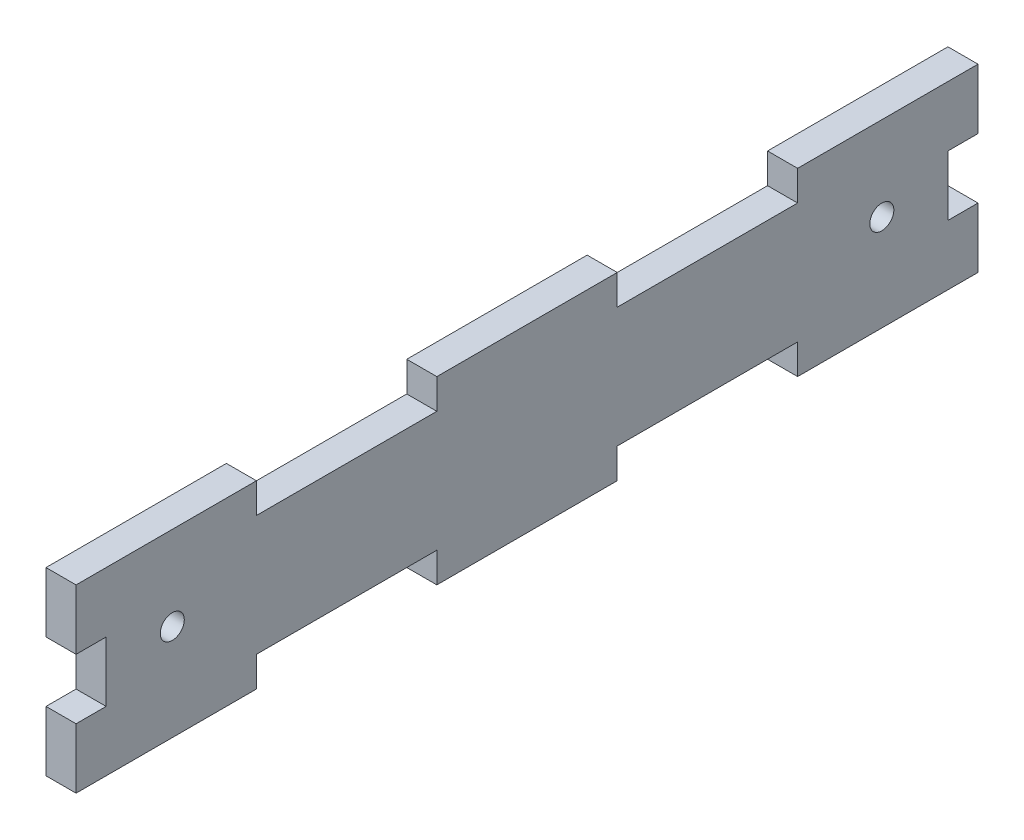
ISO-10303-21;
HEADER;
FILE_DESCRIPTION(('STEP AP214'),'2;1');
FILE_NAME('part.step','',(''),(''),'','','');
FILE_SCHEMA(('AUTOMOTIVE_DESIGN { 1 0 10303 214 1 1 1 1 }'));
ENDSEC;
DATA;
#1=APPLICATION_CONTEXT('core data for automotive mechanical design processes');
#2=APPLICATION_PROTOCOL_DEFINITION('international standard','automotive_design',2000,#1);
#3=PRODUCT_CONTEXT('',#1,'mechanical');
#4=PRODUCT('Part','Part','',(#3));
#5=PRODUCT_RELATED_PRODUCT_CATEGORY('part','',(#4));
#6=PRODUCT_DEFINITION_FORMATION('','',#4);
#7=PRODUCT_DEFINITION_CONTEXT('part definition',#1,'design');
#8=PRODUCT_DEFINITION('design','',#6,#7);
#9=PRODUCT_DEFINITION_SHAPE('','',#8);
#10=(LENGTH_UNIT() NAMED_UNIT(*) SI_UNIT(.MILLI.,.METRE.));
#11=(NAMED_UNIT(*) PLANE_ANGLE_UNIT() SI_UNIT($,.RADIAN.));
#12=(NAMED_UNIT(*) SI_UNIT($,.STERADIAN.) SOLID_ANGLE_UNIT());
#13=UNCERTAINTY_MEASURE_WITH_UNIT(LENGTH_MEASURE(1.E-05),#10,'distance_accuracy_value','');
#14=(GEOMETRIC_REPRESENTATION_CONTEXT(3) GLOBAL_UNCERTAINTY_ASSIGNED_CONTEXT((#13)) GLOBAL_UNIT_ASSIGNED_CONTEXT((#10,
#11,#12)) REPRESENTATION_CONTEXT('',''));
#15=CARTESIAN_POINT('',(0.,0.,0.));
#16=DIRECTION('',(0.,0.,1.));
#17=DIRECTION('',(1.,0.,0.));
#18=AXIS2_PLACEMENT_3D('',#15,#16,#17);
#19=CARTESIAN_POINT('',(5.,0.,0.));
#20=DIRECTION('',(1.,0.,0.));
#21=DIRECTION('',(0.,0.,-1.));
#22=AXIS2_PLACEMENT_3D('',#19,#20,#21);
#23=PLANE('',#22);
#24=CARTESIAN_POINT('',(5.,16.,-16.));
#25=DIRECTION('',(1.,0.,0.));
#26=DIRECTION('',(0.,0.,-1.));
#27=AXIS2_PLACEMENT_3D('',#24,#25,#26);
#28=CIRCLE('',#27,2.);
#29=CARTESIAN_POINT('',(5.,16.,-18.));
#30=VERTEX_POINT('',#29);
#31=EDGE_CURVE('E258',#30,#30,#28,.T.);
#32=ORIENTED_EDGE('',*,*,#31,.F.);
#33=EDGE_LOOP('',(#32));
#34=FACE_BOUND('',#33,.T.);
#35=DIRECTION('',(0.,-1.,0.));
#36=VECTOR('',#35,1.);
#37=CARTESIAN_POINT('',(5.,0.,0.));
#38=LINE('',#37,#36);
#39=CARTESIAN_POINT('',(5.,10.,0.));
#40=VERTEX_POINT('',#39);
#41=CARTESIAN_POINT('',(5.,0.,0.));
#42=VERTEX_POINT('',#41);
#43=EDGE_CURVE('E309',#40,#42,#38,.T.);
#44=ORIENTED_EDGE('',*,*,#43,.T.);
#45=DIRECTION('',(0.,0.,-1.));
#46=VECTOR('',#45,1.);
#47=CARTESIAN_POINT('',(5.,0.,0.));
#48=LINE('',#47,#46);
#49=CARTESIAN_POINT('',(5.,0.,-30.));
#50=VERTEX_POINT('',#49);
#51=EDGE_CURVE('E157',#42,#50,#48,.T.);
#52=ORIENTED_EDGE('',*,*,#51,.T.);
#53=DIRECTION('',(0.,1.,0.));
#54=VECTOR('',#53,1.);
#55=CARTESIAN_POINT('',(5.,0.,-30.));
#56=LINE('',#55,#54);
#57=CARTESIAN_POINT('',(5.,5.,-30.));
#58=VERTEX_POINT('',#57);
#59=EDGE_CURVE('E384',#50,#58,#56,.T.);
#60=ORIENTED_EDGE('',*,*,#59,.T.);
#61=DIRECTION('',(0.,0.,-1.));
#62=VECTOR('',#61,1.);
#63=CARTESIAN_POINT('',(5.,5.,-30.));
#64=LINE('',#63,#62);
#65=CARTESIAN_POINT('',(5.,5.,-60.));
#66=VERTEX_POINT('',#65);
#67=EDGE_CURVE('E403',#58,#66,#64,.T.);
#68=ORIENTED_EDGE('',*,*,#67,.T.);
#69=DIRECTION('',(0.,-1.,0.));
#70=VECTOR('',#69,1.);
#71=CARTESIAN_POINT('',(5.,5.,-60.));
#72=LINE('',#71,#70);
#73=CARTESIAN_POINT('',(5.,0.,-60.));
#74=VERTEX_POINT('',#73);
#75=EDGE_CURVE('E400',#66,#74,#72,.T.);
#76=ORIENTED_EDGE('',*,*,#75,.T.);
#77=DIRECTION('',(0.,0.,-1.));
#78=VECTOR('',#77,1.);
#79=CARTESIAN_POINT('',(5.,0.,-60.));
#80=LINE('',#79,#78);
#81=CARTESIAN_POINT('',(5.,0.,-90.));
#82=VERTEX_POINT('',#81);
#83=EDGE_CURVE('E402',#74,#82,#80,.T.);
#84=ORIENTED_EDGE('',*,*,#83,.T.);
#85=DIRECTION('',(0.,1.,0.));
#86=VECTOR('',#85,1.);
#87=CARTESIAN_POINT('',(5.,5.,-90.));
#88=LINE('',#87,#86);
#89=CARTESIAN_POINT('',(5.,5.,-90.));
#90=VERTEX_POINT('',#89);
#91=EDGE_CURVE('E405',#82,#90,#88,.T.);
#92=ORIENTED_EDGE('',*,*,#91,.T.);
#93=DIRECTION('',(0.,0.,-1.));
#94=VECTOR('',#93,1.);
#95=CARTESIAN_POINT('',(5.,5.00000000000001,-120.));
#96=LINE('',#95,#94);
#97=CARTESIAN_POINT('',(5.,5.00000000000001,-120.));
#98=VERTEX_POINT('',#97);
#99=EDGE_CURVE('E411',#90,#98,#96,.T.);
#100=ORIENTED_EDGE('',*,*,#99,.T.);
#101=DIRECTION('',(0.,-1.,0.));
#102=VECTOR('',#101,1.);
#103=CARTESIAN_POINT('',(5.,0.,-120.));
#104=LINE('',#103,#102);
#105=CARTESIAN_POINT('',(5.,0.,-120.));
#106=VERTEX_POINT('',#105);
#107=EDGE_CURVE('E413',#98,#106,#104,.T.);
#108=ORIENTED_EDGE('',*,*,#107,.T.);
#109=DIRECTION('',(0.,0.,-1.));
#110=VECTOR('',#109,1.);
#111=CARTESIAN_POINT('',(5.,0.,-120.));
#112=LINE('',#111,#110);
#113=CARTESIAN_POINT('',(5.,0.,-150.));
#114=VERTEX_POINT('',#113);
#115=EDGE_CURVE('E415',#106,#114,#112,.T.);
#116=ORIENTED_EDGE('',*,*,#115,.T.);
#117=DIRECTION('',(0.,1.,0.));
#118=VECTOR('',#117,1.);
#119=CARTESIAN_POINT('',(5.,0.,-150.));
#120=LINE('',#119,#118);
#121=CARTESIAN_POINT('',(5.,10.,-150.));
#122=VERTEX_POINT('',#121);
#123=EDGE_CURVE('E417',#114,#122,#120,.T.);
#124=ORIENTED_EDGE('',*,*,#123,.T.);
#125=DIRECTION('',(0.,0.,1.));
#126=VECTOR('',#125,1.);
#127=CARTESIAN_POINT('',(5.,10.,-145.));
#128=LINE('',#127,#126);
#129=CARTESIAN_POINT('',(5.,10.,-145.));
#130=VERTEX_POINT('',#129);
#131=EDGE_CURVE('E419',#122,#130,#128,.T.);
#132=ORIENTED_EDGE('',*,*,#131,.T.);
#133=DIRECTION('',(0.,1.,0.));
#134=VECTOR('',#133,1.);
#135=CARTESIAN_POINT('',(5.,20.,-145.));
#136=LINE('',#135,#134);
#137=CARTESIAN_POINT('',(5.,20.,-145.));
#138=VERTEX_POINT('',#137);
#139=EDGE_CURVE('E421',#130,#138,#136,.T.);
#140=ORIENTED_EDGE('',*,*,#139,.T.);
#141=DIRECTION('',(0.,0.,-1.));
#142=VECTOR('',#141,1.);
#143=CARTESIAN_POINT('',(5.,20.,-150.));
#144=LINE('',#143,#142);
#145=CARTESIAN_POINT('',(5.,20.,-150.));
#146=VERTEX_POINT('',#145);
#147=EDGE_CURVE('E423',#138,#146,#144,.T.);
#148=ORIENTED_EDGE('',*,*,#147,.T.);
#149=DIRECTION('',(0.,1.,0.));
#150=VECTOR('',#149,1.);
#151=CARTESIAN_POINT('',(5.,20.,-150.));
#152=LINE('',#151,#150);
#153=CARTESIAN_POINT('',(5.,30.,-150.));
#154=VERTEX_POINT('',#153);
#155=EDGE_CURVE('E425',#146,#154,#152,.T.);
#156=ORIENTED_EDGE('',*,*,#155,.T.);
#157=DIRECTION('',(0.,0.,1.));
#158=VECTOR('',#157,1.);
#159=CARTESIAN_POINT('',(5.,30.,-120.));
#160=LINE('',#159,#158);
#161=CARTESIAN_POINT('',(5.,30.,-120.));
#162=VERTEX_POINT('',#161);
#163=EDGE_CURVE('E427',#154,#162,#160,.T.);
#164=ORIENTED_EDGE('',*,*,#163,.T.);
#165=DIRECTION('',(0.,-1.,0.));
#166=VECTOR('',#165,1.);
#167=CARTESIAN_POINT('',(5.,30.,-120.));
#168=LINE('',#167,#166);
#169=CARTESIAN_POINT('',(5.,25.,-120.));
#170=VERTEX_POINT('',#169);
#171=EDGE_CURVE('E429',#162,#170,#168,.T.);
#172=ORIENTED_EDGE('',*,*,#171,.T.);
#173=DIRECTION('',(0.,0.,1.));
#174=VECTOR('',#173,1.);
#175=CARTESIAN_POINT('',(5.,25.,-120.));
#176=LINE('',#175,#174);
#177=CARTESIAN_POINT('',(5.,25.,-90.));
#178=VERTEX_POINT('',#177);
#179=EDGE_CURVE('E431',#170,#178,#176,.T.);
#180=ORIENTED_EDGE('',*,*,#179,.T.);
#181=DIRECTION('',(0.,1.,0.));
#182=VECTOR('',#181,1.);
#183=CARTESIAN_POINT('',(5.,25.,-90.));
#184=LINE('',#183,#182);
#185=CARTESIAN_POINT('',(5.,30.,-90.));
#186=VERTEX_POINT('',#185);
#187=EDGE_CURVE('E433',#178,#186,#184,.T.);
#188=ORIENTED_EDGE('',*,*,#187,.T.);
#189=DIRECTION('',(0.,0.,1.));
#190=VECTOR('',#189,1.);
#191=CARTESIAN_POINT('',(5.,30.,-60.));
#192=LINE('',#191,#190);
#193=CARTESIAN_POINT('',(5.,30.,-60.));
#194=VERTEX_POINT('',#193);
#195=EDGE_CURVE('E435',#186,#194,#192,.T.);
#196=ORIENTED_EDGE('',*,*,#195,.T.);
#197=DIRECTION('',(0.,-1.,0.));
#198=VECTOR('',#197,1.);
#199=CARTESIAN_POINT('',(5.,25.,-60.));
#200=LINE('',#199,#198);
#201=CARTESIAN_POINT('',(5.,25.,-60.));
#202=VERTEX_POINT('',#201);
#203=EDGE_CURVE('E437',#194,#202,#200,.T.);
#204=ORIENTED_EDGE('',*,*,#203,.T.);
#205=DIRECTION('',(0.,0.,1.));
#206=VECTOR('',#205,1.);
#207=CARTESIAN_POINT('',(5.,25.,-30.));
#208=LINE('',#207,#206);
#209=CARTESIAN_POINT('',(5.,25.,-30.));
#210=VERTEX_POINT('',#209);
#211=EDGE_CURVE('E439',#202,#210,#208,.T.);
#212=ORIENTED_EDGE('',*,*,#211,.T.);
#213=DIRECTION('',(0.,1.,0.));
#214=VECTOR('',#213,1.);
#215=CARTESIAN_POINT('',(5.,30.,-30.));
#216=LINE('',#215,#214);
#217=CARTESIAN_POINT('',(5.,30.,-30.));
#218=VERTEX_POINT('',#217);
#219=EDGE_CURVE('E441',#210,#218,#216,.T.);
#220=ORIENTED_EDGE('',*,*,#219,.T.);
#221=DIRECTION('',(0.,0.,1.));
#222=VECTOR('',#221,1.);
#223=CARTESIAN_POINT('',(5.,30.,0.));
#224=LINE('',#223,#222);
#225=CARTESIAN_POINT('',(5.,30.,0.));
#226=VERTEX_POINT('',#225);
#227=EDGE_CURVE('E443',#218,#226,#224,.T.);
#228=ORIENTED_EDGE('',*,*,#227,.T.);
#229=DIRECTION('',(0.,-1.,0.));
#230=VECTOR('',#229,1.);
#231=CARTESIAN_POINT('',(5.,20.,0.));
#232=LINE('',#231,#230);
#233=CARTESIAN_POINT('',(5.,20.,0.));
#234=VERTEX_POINT('',#233);
#235=EDGE_CURVE('E236',#226,#234,#232,.T.);
#236=ORIENTED_EDGE('',*,*,#235,.T.);
#237=DIRECTION('',(0.,0.,-1.));
#238=VECTOR('',#237,1.);
#239=CARTESIAN_POINT('',(5.,20.,0.));
#240=LINE('',#239,#238);
#241=CARTESIAN_POINT('',(5.,20.,-5.));
#242=VERTEX_POINT('',#241);
#243=EDGE_CURVE('E230',#234,#242,#240,.T.);
#244=ORIENTED_EDGE('',*,*,#243,.T.);
#245=DIRECTION('',(0.,-1.,0.));
#246=VECTOR('',#245,1.);
#247=CARTESIAN_POINT('',(5.,20.,-5.));
#248=LINE('',#247,#246);
#249=CARTESIAN_POINT('',(5.,10.,-5.));
#250=VERTEX_POINT('',#249);
#251=EDGE_CURVE('E234',#242,#250,#248,.T.);
#252=ORIENTED_EDGE('',*,*,#251,.T.);
#253=DIRECTION('',(0.,0.,1.));
#254=VECTOR('',#253,1.);
#255=CARTESIAN_POINT('',(5.,10.,-5.));
#256=LINE('',#255,#254);
#257=EDGE_CURVE('E54',#250,#40,#256,.T.);
#258=ORIENTED_EDGE('',*,*,#257,.T.);
#259=EDGE_LOOP('',(#44,#52,#60,#68,#76,#84,#92,#100,#108,#116,#124,#132,#140,#148,#156,#164,
#172,#180,#188,#196,#204,#212,#220,#228,#236,#244,#252,#258));
#260=FACE_BOUND('',#259,.T.);
#261=CARTESIAN_POINT('',(5.,16.,-134.));
#262=DIRECTION('',(1.,0.,0.));
#263=DIRECTION('',(0.,0.,1.));
#264=AXIS2_PLACEMENT_3D('',#261,#262,#263);
#265=CIRCLE('',#264,2.);
#266=CARTESIAN_POINT('',(5.,16.,-132.));
#267=VERTEX_POINT('',#266);
#268=EDGE_CURVE('E485',#267,#267,#265,.T.);
#269=ORIENTED_EDGE('',*,*,#268,.F.);
#270=EDGE_LOOP('',(#269));
#271=FACE_BOUND('',#270,.T.);
#272=ADVANCED_FACE('F37',(#34,#260,#271),#23,.T.);
#273=CARTESIAN_POINT('',(0.,0.,0.));
#274=DIRECTION('',(1.,0.,0.));
#275=DIRECTION('',(0.,0.,-1.));
#276=AXIS2_PLACEMENT_3D('',#273,#274,#275);
#277=PLANE('',#276);
#278=DIRECTION('',(0.,-1.,0.));
#279=VECTOR('',#278,1.);
#280=CARTESIAN_POINT('',(0.,0.,0.));
#281=LINE('',#280,#279);
#282=CARTESIAN_POINT('',(0.,10.,0.));
#283=VERTEX_POINT('',#282);
#284=CARTESIAN_POINT('',(0.,0.,0.));
#285=VERTEX_POINT('',#284);
#286=EDGE_CURVE('E254',#283,#285,#281,.T.);
#287=ORIENTED_EDGE('',*,*,#286,.F.);
#288=DIRECTION('',(0.,0.,1.));
#289=VECTOR('',#288,1.);
#290=CARTESIAN_POINT('',(0.,10.,-5.));
#291=LINE('',#290,#289);
#292=CARTESIAN_POINT('',(0.,10.,-5.));
#293=VERTEX_POINT('',#292);
#294=EDGE_CURVE('E149',#293,#283,#291,.T.);
#295=ORIENTED_EDGE('',*,*,#294,.F.);
#296=DIRECTION('',(0.,-1.,0.));
#297=VECTOR('',#296,1.);
#298=CARTESIAN_POINT('',(0.,20.,-5.));
#299=LINE('',#298,#297);
#300=CARTESIAN_POINT('',(0.,20.,-5.));
#301=VERTEX_POINT('',#300);
#302=EDGE_CURVE('E143',#301,#293,#299,.T.);
#303=ORIENTED_EDGE('',*,*,#302,.F.);
#304=DIRECTION('',(0.,0.,-1.));
#305=VECTOR('',#304,1.);
#306=CARTESIAN_POINT('',(0.,20.,0.));
#307=LINE('',#306,#305);
#308=CARTESIAN_POINT('',(0.,20.,0.));
#309=VERTEX_POINT('',#308);
#310=EDGE_CURVE('E244',#309,#301,#307,.T.);
#311=ORIENTED_EDGE('',*,*,#310,.F.);
#312=DIRECTION('',(0.,-1.,0.));
#313=VECTOR('',#312,1.);
#314=CARTESIAN_POINT('',(0.,20.,0.));
#315=LINE('',#314,#313);
#316=CARTESIAN_POINT('',(0.,30.,0.));
#317=VERTEX_POINT('',#316);
#318=EDGE_CURVE('E304',#317,#309,#315,.T.);
#319=ORIENTED_EDGE('',*,*,#318,.F.);
#320=DIRECTION('',(0.,0.,1.));
#321=VECTOR('',#320,1.);
#322=CARTESIAN_POINT('',(0.,30.,0.));
#323=LINE('',#322,#321);
#324=CARTESIAN_POINT('',(0.,30.,-30.));
#325=VERTEX_POINT('',#324);
#326=EDGE_CURVE('E302',#325,#317,#323,.T.);
#327=ORIENTED_EDGE('',*,*,#326,.F.);
#328=DIRECTION('',(0.,1.,0.));
#329=VECTOR('',#328,1.);
#330=CARTESIAN_POINT('',(0.,30.,-30.));
#331=LINE('',#330,#329);
#332=CARTESIAN_POINT('',(0.,25.,-30.));
#333=VERTEX_POINT('',#332);
#334=EDGE_CURVE('E300',#333,#325,#331,.T.);
#335=ORIENTED_EDGE('',*,*,#334,.F.);
#336=DIRECTION('',(0.,0.,1.));
#337=VECTOR('',#336,1.);
#338=CARTESIAN_POINT('',(0.,25.,-30.));
#339=LINE('',#338,#337);
#340=CARTESIAN_POINT('',(0.,25.,-60.));
#341=VERTEX_POINT('',#340);
#342=EDGE_CURVE('E298',#341,#333,#339,.T.);
#343=ORIENTED_EDGE('',*,*,#342,.F.);
#344=DIRECTION('',(0.,-1.,0.));
#345=VECTOR('',#344,1.);
#346=CARTESIAN_POINT('',(0.,25.,-60.));
#347=LINE('',#346,#345);
#348=CARTESIAN_POINT('',(0.,30.,-60.));
#349=VERTEX_POINT('',#348);
#350=EDGE_CURVE('E296',#349,#341,#347,.T.);
#351=ORIENTED_EDGE('',*,*,#350,.F.);
#352=DIRECTION('',(0.,0.,1.));
#353=VECTOR('',#352,1.);
#354=CARTESIAN_POINT('',(0.,30.,-60.));
#355=LINE('',#354,#353);
#356=CARTESIAN_POINT('',(0.,30.,-90.));
#357=VERTEX_POINT('',#356);
#358=EDGE_CURVE('E294',#357,#349,#355,.T.);
#359=ORIENTED_EDGE('',*,*,#358,.F.);
#360=DIRECTION('',(0.,1.,0.));
#361=VECTOR('',#360,1.);
#362=CARTESIAN_POINT('',(0.,25.,-90.));
#363=LINE('',#362,#361);
#364=CARTESIAN_POINT('',(0.,25.,-90.));
#365=VERTEX_POINT('',#364);
#366=EDGE_CURVE('E292',#365,#357,#363,.T.);
#367=ORIENTED_EDGE('',*,*,#366,.F.);
#368=DIRECTION('',(0.,0.,1.));
#369=VECTOR('',#368,1.);
#370=CARTESIAN_POINT('',(0.,25.,-120.));
#371=LINE('',#370,#369);
#372=CARTESIAN_POINT('',(0.,25.,-120.));
#373=VERTEX_POINT('',#372);
#374=EDGE_CURVE('E290',#373,#365,#371,.T.);
#375=ORIENTED_EDGE('',*,*,#374,.F.);
#376=DIRECTION('',(0.,-1.,0.));
#377=VECTOR('',#376,1.);
#378=CARTESIAN_POINT('',(0.,30.,-120.));
#379=LINE('',#378,#377);
#380=CARTESIAN_POINT('',(0.,30.,-120.));
#381=VERTEX_POINT('',#380);
#382=EDGE_CURVE('E288',#381,#373,#379,.T.);
#383=ORIENTED_EDGE('',*,*,#382,.F.);
#384=DIRECTION('',(0.,0.,1.));
#385=VECTOR('',#384,1.);
#386=CARTESIAN_POINT('',(0.,30.,-120.));
#387=LINE('',#386,#385);
#388=CARTESIAN_POINT('',(0.,30.,-150.));
#389=VERTEX_POINT('',#388);
#390=EDGE_CURVE('E286',#389,#381,#387,.T.);
#391=ORIENTED_EDGE('',*,*,#390,.F.);
#392=DIRECTION('',(0.,1.,0.));
#393=VECTOR('',#392,1.);
#394=CARTESIAN_POINT('',(0.,20.,-150.));
#395=LINE('',#394,#393);
#396=CARTESIAN_POINT('',(0.,20.,-150.));
#397=VERTEX_POINT('',#396);
#398=EDGE_CURVE('E284',#397,#389,#395,.T.);
#399=ORIENTED_EDGE('',*,*,#398,.F.);
#400=DIRECTION('',(0.,0.,-1.));
#401=VECTOR('',#400,1.);
#402=CARTESIAN_POINT('',(0.,20.,-150.));
#403=LINE('',#402,#401);
#404=CARTESIAN_POINT('',(0.,20.,-145.));
#405=VERTEX_POINT('',#404);
#406=EDGE_CURVE('E282',#405,#397,#403,.T.);
#407=ORIENTED_EDGE('',*,*,#406,.F.);
#408=DIRECTION('',(0.,1.,0.));
#409=VECTOR('',#408,1.);
#410=CARTESIAN_POINT('',(0.,20.,-145.));
#411=LINE('',#410,#409);
#412=CARTESIAN_POINT('',(0.,10.,-145.));
#413=VERTEX_POINT('',#412);
#414=EDGE_CURVE('E280',#413,#405,#411,.T.);
#415=ORIENTED_EDGE('',*,*,#414,.F.);
#416=DIRECTION('',(0.,0.,1.));
#417=VECTOR('',#416,1.);
#418=CARTESIAN_POINT('',(0.,10.,-145.));
#419=LINE('',#418,#417);
#420=CARTESIAN_POINT('',(0.,10.,-150.));
#421=VERTEX_POINT('',#420);
#422=EDGE_CURVE('E278',#421,#413,#419,.T.);
#423=ORIENTED_EDGE('',*,*,#422,.F.);
#424=DIRECTION('',(0.,1.,0.));
#425=VECTOR('',#424,1.);
#426=CARTESIAN_POINT('',(0.,0.,-150.));
#427=LINE('',#426,#425);
#428=CARTESIAN_POINT('',(0.,0.,-150.));
#429=VERTEX_POINT('',#428);
#430=EDGE_CURVE('E276',#429,#421,#427,.T.);
#431=ORIENTED_EDGE('',*,*,#430,.F.);
#432=DIRECTION('',(0.,0.,-1.));
#433=VECTOR('',#432,1.);
#434=CARTESIAN_POINT('',(0.,0.,-120.));
#435=LINE('',#434,#433);
#436=CARTESIAN_POINT('',(0.,0.,-120.));
#437=VERTEX_POINT('',#436);
#438=EDGE_CURVE('E274',#437,#429,#435,.T.);
#439=ORIENTED_EDGE('',*,*,#438,.F.);
#440=DIRECTION('',(0.,-1.,0.));
#441=VECTOR('',#440,1.);
#442=CARTESIAN_POINT('',(0.,0.,-120.));
#443=LINE('',#442,#441);
#444=CARTESIAN_POINT('',(0.,5.00000000000001,-120.));
#445=VERTEX_POINT('',#444);
#446=EDGE_CURVE('E272',#445,#437,#443,.T.);
#447=ORIENTED_EDGE('',*,*,#446,.F.);
#448=DIRECTION('',(0.,0.,-1.));
#449=VECTOR('',#448,1.);
#450=CARTESIAN_POINT('',(0.,5.00000000000001,-120.));
#451=LINE('',#450,#449);
#452=CARTESIAN_POINT('',(0.,5.,-90.));
#453=VERTEX_POINT('',#452);
#454=EDGE_CURVE('E270',#453,#445,#451,.T.);
#455=ORIENTED_EDGE('',*,*,#454,.F.);
#456=DIRECTION('',(0.,1.,0.));
#457=VECTOR('',#456,1.);
#458=CARTESIAN_POINT('',(0.,5.,-90.));
#459=LINE('',#458,#457);
#460=CARTESIAN_POINT('',(0.,0.,-90.));
#461=VERTEX_POINT('',#460);
#462=EDGE_CURVE('E268',#461,#453,#459,.T.);
#463=ORIENTED_EDGE('',*,*,#462,.F.);
#464=DIRECTION('',(0.,0.,-1.));
#465=VECTOR('',#464,1.);
#466=CARTESIAN_POINT('',(0.,0.,-60.));
#467=LINE('',#466,#465);
#468=CARTESIAN_POINT('',(0.,0.,-60.));
#469=VERTEX_POINT('',#468);
#470=EDGE_CURVE('E266',#469,#461,#467,.T.);
#471=ORIENTED_EDGE('',*,*,#470,.F.);
#472=DIRECTION('',(0.,-1.,0.));
#473=VECTOR('',#472,1.);
#474=CARTESIAN_POINT('',(0.,5.,-60.));
#475=LINE('',#474,#473);
#476=CARTESIAN_POINT('',(0.,5.,-60.));
#477=VERTEX_POINT('',#476);
#478=EDGE_CURVE('E264',#477,#469,#475,.T.);
#479=ORIENTED_EDGE('',*,*,#478,.F.);
#480=DIRECTION('',(0.,0.,-1.));
#481=VECTOR('',#480,1.);
#482=CARTESIAN_POINT('',(0.,5.,-30.));
#483=LINE('',#482,#481);
#484=CARTESIAN_POINT('',(0.,5.,-30.));
#485=VERTEX_POINT('',#484);
#486=EDGE_CURVE('E262',#485,#477,#483,.T.);
#487=ORIENTED_EDGE('',*,*,#486,.F.);
#488=DIRECTION('',(0.,1.,0.));
#489=VECTOR('',#488,1.);
#490=CARTESIAN_POINT('',(0.,0.,-30.));
#491=LINE('',#490,#489);
#492=CARTESIAN_POINT('',(0.,0.,-30.));
#493=VERTEX_POINT('',#492);
#494=EDGE_CURVE('E260',#493,#485,#491,.T.);
#495=ORIENTED_EDGE('',*,*,#494,.F.);
#496=DIRECTION('',(0.,0.,-1.));
#497=VECTOR('',#496,1.);
#498=CARTESIAN_POINT('',(0.,0.,0.));
#499=LINE('',#498,#497);
#500=EDGE_CURVE('E257',#285,#493,#499,.T.);
#501=ORIENTED_EDGE('',*,*,#500,.F.);
#502=EDGE_LOOP('',(#287,#295,#303,#311,#319,#327,#335,#343,#351,#359,#367,#375,#383,#391,#399,
#407,#415,#423,#431,#439,#447,#455,#463,#471,#479,#487,#495,#501));
#503=FACE_BOUND('',#502,.T.);
#504=CARTESIAN_POINT('',(0.,16.,-16.));
#505=DIRECTION('',(1.,0.,0.));
#506=DIRECTION('',(0.,0.,-1.));
#507=AXIS2_PLACEMENT_3D('',#504,#505,#506);
#508=CIRCLE('',#507,2.);
#509=CARTESIAN_POINT('',(0.,16.,-18.));
#510=VERTEX_POINT('',#509);
#511=EDGE_CURVE('E491',#510,#510,#508,.T.);
#512=ORIENTED_EDGE('',*,*,#511,.T.);
#513=EDGE_LOOP('',(#512));
#514=FACE_BOUND('',#513,.T.);
#515=CARTESIAN_POINT('',(0.,16.,-134.));
#516=DIRECTION('',(1.,0.,0.));
#517=DIRECTION('',(0.,0.,1.));
#518=AXIS2_PLACEMENT_3D('',#515,#516,#517);
#519=CIRCLE('',#518,2.);
#520=CARTESIAN_POINT('',(0.,16.,-132.));
#521=VERTEX_POINT('',#520);
#522=EDGE_CURVE('E488',#521,#521,#519,.T.);
#523=ORIENTED_EDGE('',*,*,#522,.T.);
#524=EDGE_LOOP('',(#523));
#525=FACE_BOUND('',#524,.T.);
#526=ADVANCED_FACE('F388',(#503,#514,#525),#277,.F.);
#527=CARTESIAN_POINT('',(5.,0.,0.));
#528=DIRECTION('',(0.,0.,-1.));
#529=DIRECTION('',(-1.,0.,0.));
#530=AXIS2_PLACEMENT_3D('',#527,#528,#529);
#531=PLANE('',#530);
#532=ORIENTED_EDGE('',*,*,#286,.T.);
#533=DIRECTION('',(-1.,0.,0.));
#534=VECTOR('',#533,1.);
#535=CARTESIAN_POINT('',(5.,0.,0.));
#536=LINE('',#535,#534);
#537=EDGE_CURVE('E11',#42,#285,#536,.T.);
#538=ORIENTED_EDGE('',*,*,#537,.F.);
#539=ORIENTED_EDGE('',*,*,#43,.F.);
#540=DIRECTION('',(-1.,0.,0.));
#541=VECTOR('',#540,1.);
#542=CARTESIAN_POINT('',(5.,10.,0.));
#543=LINE('',#542,#541);
#544=EDGE_CURVE('E250',#40,#283,#543,.T.);
#545=ORIENTED_EDGE('',*,*,#544,.T.);
#546=EDGE_LOOP('',(#532,#538,#539,#545));
#547=FACE_BOUND('',#546,.T.);
#548=ADVANCED_FACE('F39',(#547),#531,.F.);
#549=CARTESIAN_POINT('',(5.,0.,0.));
#550=DIRECTION('',(0.,1.,0.));
#551=DIRECTION('',(0.,0.,1.));
#552=AXIS2_PLACEMENT_3D('',#549,#550,#551);
#553=PLANE('',#552);
#554=ORIENTED_EDGE('',*,*,#500,.T.);
#555=DIRECTION('',(-1.,0.,0.));
#556=VECTOR('',#555,1.);
#557=CARTESIAN_POINT('',(5.,0.,-30.));
#558=LINE('',#557,#556);
#559=EDGE_CURVE('E46',#50,#493,#558,.T.);
#560=ORIENTED_EDGE('',*,*,#559,.F.);
#561=ORIENTED_EDGE('',*,*,#51,.F.);
#562=ORIENTED_EDGE('',*,*,#537,.T.);
#563=EDGE_LOOP('',(#554,#560,#561,#562));
#564=FACE_BOUND('',#563,.T.);
#565=ADVANCED_FACE('F744',(#564),#553,.F.);
#566=CARTESIAN_POINT('',(5.,0.,-30.));
#567=DIRECTION('',(0.,0.,1.));
#568=DIRECTION('',(1.,0.,0.));
#569=AXIS2_PLACEMENT_3D('',#566,#567,#568);
#570=PLANE('',#569);
#571=ORIENTED_EDGE('',*,*,#494,.T.);
#572=DIRECTION('',(-1.,0.,0.));
#573=VECTOR('',#572,1.);
#574=CARTESIAN_POINT('',(5.,5.,-30.));
#575=LINE('',#574,#573);
#576=EDGE_CURVE('E376',#58,#485,#575,.T.);
#577=ORIENTED_EDGE('',*,*,#576,.F.);
#578=ORIENTED_EDGE('',*,*,#59,.F.);
#579=ORIENTED_EDGE('',*,*,#559,.T.);
#580=EDGE_LOOP('',(#571,#577,#578,#579));
#581=FACE_BOUND('',#580,.T.);
#582=ADVANCED_FACE('F382',(#581),#570,.F.);
#583=CARTESIAN_POINT('',(5.,5.,-30.));
#584=DIRECTION('',(0.,1.,0.));
#585=DIRECTION('',(0.,0.,1.));
#586=AXIS2_PLACEMENT_3D('',#583,#584,#585);
#587=PLANE('',#586);
#588=ORIENTED_EDGE('',*,*,#486,.T.);
#589=DIRECTION('',(-1.,0.,0.));
#590=VECTOR('',#589,1.);
#591=CARTESIAN_POINT('',(5.,5.,-60.));
#592=LINE('',#591,#590);
#593=EDGE_CURVE('E373',#66,#477,#592,.T.);
#594=ORIENTED_EDGE('',*,*,#593,.F.);
#595=ORIENTED_EDGE('',*,*,#67,.F.);
#596=ORIENTED_EDGE('',*,*,#576,.T.);
#597=EDGE_LOOP('',(#588,#594,#595,#596));
#598=FACE_BOUND('',#597,.T.);
#599=ADVANCED_FACE('F394',(#598),#587,.F.);
#600=CARTESIAN_POINT('',(5.,5.,-60.));
#601=DIRECTION('',(0.,0.,-1.));
#602=DIRECTION('',(-1.,0.,0.));
#603=AXIS2_PLACEMENT_3D('',#600,#601,#602);
#604=PLANE('',#603);
#605=ORIENTED_EDGE('',*,*,#478,.T.);
#606=DIRECTION('',(-1.,0.,0.));
#607=VECTOR('',#606,1.);
#608=CARTESIAN_POINT('',(5.,0.,-60.));
#609=LINE('',#608,#607);
#610=EDGE_CURVE('E370',#74,#469,#609,.T.);
#611=ORIENTED_EDGE('',*,*,#610,.F.);
#612=ORIENTED_EDGE('',*,*,#75,.F.);
#613=ORIENTED_EDGE('',*,*,#593,.T.);
#614=EDGE_LOOP('',(#605,#611,#612,#613));
#615=FACE_BOUND('',#614,.T.);
#616=ADVANCED_FACE('F398',(#615),#604,.F.);
#617=CARTESIAN_POINT('',(5.,0.,-60.));
#618=DIRECTION('',(0.,1.,0.));
#619=DIRECTION('',(0.,0.,1.));
#620=AXIS2_PLACEMENT_3D('',#617,#618,#619);
#621=PLANE('',#620);
#622=ORIENTED_EDGE('',*,*,#470,.T.);
#623=DIRECTION('',(-1.,0.,0.));
#624=VECTOR('',#623,1.);
#625=CARTESIAN_POINT('',(5.,0.,-90.));
#626=LINE('',#625,#624);
#627=EDGE_CURVE('E367',#82,#461,#626,.T.);
#628=ORIENTED_EDGE('',*,*,#627,.F.);
#629=ORIENTED_EDGE('',*,*,#83,.F.);
#630=ORIENTED_EDGE('',*,*,#610,.T.);
#631=EDGE_LOOP('',(#622,#628,#629,#630));
#632=FACE_BOUND('',#631,.T.);
#633=ADVANCED_FACE('F709',(#632),#621,.F.);
#634=CARTESIAN_POINT('',(5.,5.,-90.));
#635=DIRECTION('',(0.,0.,1.));
#636=DIRECTION('',(1.,0.,0.));
#637=AXIS2_PLACEMENT_3D('',#634,#635,#636);
#638=PLANE('',#637);
#639=ORIENTED_EDGE('',*,*,#462,.T.);
#640=DIRECTION('',(-1.,0.,0.));
#641=VECTOR('',#640,1.);
#642=CARTESIAN_POINT('',(5.,5.,-90.));
#643=LINE('',#642,#641);
#644=EDGE_CURVE('E364',#90,#453,#643,.T.);
#645=ORIENTED_EDGE('',*,*,#644,.F.);
#646=ORIENTED_EDGE('',*,*,#91,.F.);
#647=ORIENTED_EDGE('',*,*,#627,.T.);
#648=EDGE_LOOP('',(#639,#645,#646,#647));
#649=FACE_BOUND('',#648,.T.);
#650=ADVANCED_FACE('F699',(#649),#638,.F.);
#651=CARTESIAN_POINT('',(5.,5.00000000000001,-120.));
#652=DIRECTION('',(0.,1.,0.));
#653=DIRECTION('',(0.,0.,1.));
#654=AXIS2_PLACEMENT_3D('',#651,#652,#653);
#655=PLANE('',#654);
#656=ORIENTED_EDGE('',*,*,#454,.T.);
#657=DIRECTION('',(-1.,0.,0.));
#658=VECTOR('',#657,1.);
#659=CARTESIAN_POINT('',(5.,5.00000000000001,-120.));
#660=LINE('',#659,#658);
#661=EDGE_CURVE('E361',#98,#445,#660,.T.);
#662=ORIENTED_EDGE('',*,*,#661,.F.);
#663=ORIENTED_EDGE('',*,*,#99,.F.);
#664=ORIENTED_EDGE('',*,*,#644,.T.);
#665=EDGE_LOOP('',(#656,#662,#663,#664));
#666=FACE_BOUND('',#665,.T.);
#667=ADVANCED_FACE('F689',(#666),#655,.F.);
#668=CARTESIAN_POINT('',(5.,0.,-120.));
#669=DIRECTION('',(0.,0.,-1.));
#670=DIRECTION('',(0.,1.,0.));
#671=AXIS2_PLACEMENT_3D('',#668,#669,#670);
#672=PLANE('',#671);
#673=ORIENTED_EDGE('',*,*,#446,.T.);
#674=DIRECTION('',(-1.,0.,0.));
#675=VECTOR('',#674,1.);
#676=CARTESIAN_POINT('',(5.,0.,-120.));
#677=LINE('',#676,#675);
#678=EDGE_CURVE('E358',#106,#437,#677,.T.);
#679=ORIENTED_EDGE('',*,*,#678,.F.);
#680=ORIENTED_EDGE('',*,*,#107,.F.);
#681=ORIENTED_EDGE('',*,*,#661,.T.);
#682=EDGE_LOOP('',(#673,#679,#680,#681));
#683=FACE_BOUND('',#682,.T.);
#684=ADVANCED_FACE('F679',(#683),#672,.F.);
#685=CARTESIAN_POINT('',(5.,0.,-120.));
#686=DIRECTION('',(0.,1.,0.));
#687=DIRECTION('',(0.,0.,1.));
#688=AXIS2_PLACEMENT_3D('',#685,#686,#687);
#689=PLANE('',#688);
#690=ORIENTED_EDGE('',*,*,#438,.T.);
#691=DIRECTION('',(-1.,0.,0.));
#692=VECTOR('',#691,1.);
#693=CARTESIAN_POINT('',(5.,0.,-150.));
#694=LINE('',#693,#692);
#695=EDGE_CURVE('E355',#114,#429,#694,.T.);
#696=ORIENTED_EDGE('',*,*,#695,.F.);
#697=ORIENTED_EDGE('',*,*,#115,.F.);
#698=ORIENTED_EDGE('',*,*,#678,.T.);
#699=EDGE_LOOP('',(#690,#696,#697,#698));
#700=FACE_BOUND('',#699,.T.);
#701=ADVANCED_FACE('F669',(#700),#689,.F.);
#702=CARTESIAN_POINT('',(5.,0.,-150.));
#703=DIRECTION('',(0.,0.,1.));
#704=DIRECTION('',(1.,0.,0.));
#705=AXIS2_PLACEMENT_3D('',#702,#703,#704);
#706=PLANE('',#705);
#707=ORIENTED_EDGE('',*,*,#430,.T.);
#708=DIRECTION('',(-1.,0.,0.));
#709=VECTOR('',#708,1.);
#710=CARTESIAN_POINT('',(5.,10.,-150.));
#711=LINE('',#710,#709);
#712=EDGE_CURVE('E352',#122,#421,#711,.T.);
#713=ORIENTED_EDGE('',*,*,#712,.F.);
#714=ORIENTED_EDGE('',*,*,#123,.F.);
#715=ORIENTED_EDGE('',*,*,#695,.T.);
#716=EDGE_LOOP('',(#707,#713,#714,#715));
#717=FACE_BOUND('',#716,.T.);
#718=ADVANCED_FACE('F659',(#717),#706,.F.);
#719=CARTESIAN_POINT('',(5.,10.,-145.));
#720=DIRECTION('',(0.,-1.,0.));
#721=DIRECTION('',(0.,0.,-1.));
#722=AXIS2_PLACEMENT_3D('',#719,#720,#721);
#723=PLANE('',#722);
#724=ORIENTED_EDGE('',*,*,#422,.T.);
#725=DIRECTION('',(-1.,0.,0.));
#726=VECTOR('',#725,1.);
#727=CARTESIAN_POINT('',(5.,10.,-145.));
#728=LINE('',#727,#726);
#729=EDGE_CURVE('E349',#130,#413,#728,.T.);
#730=ORIENTED_EDGE('',*,*,#729,.F.);
#731=ORIENTED_EDGE('',*,*,#131,.F.);
#732=ORIENTED_EDGE('',*,*,#712,.T.);
#733=EDGE_LOOP('',(#724,#730,#731,#732));
#734=FACE_BOUND('',#733,.T.);
#735=ADVANCED_FACE('F649',(#734),#723,.F.);
#736=CARTESIAN_POINT('',(5.,20.,-145.));
#737=DIRECTION('',(0.,0.,1.));
#738=DIRECTION('',(1.,0.,0.));
#739=AXIS2_PLACEMENT_3D('',#736,#737,#738);
#740=PLANE('',#739);
#741=ORIENTED_EDGE('',*,*,#414,.T.);
#742=DIRECTION('',(-1.,0.,0.));
#743=VECTOR('',#742,1.);
#744=CARTESIAN_POINT('',(5.,20.,-145.));
#745=LINE('',#744,#743);
#746=EDGE_CURVE('E346',#138,#405,#745,.T.);
#747=ORIENTED_EDGE('',*,*,#746,.F.);
#748=ORIENTED_EDGE('',*,*,#139,.F.);
#749=ORIENTED_EDGE('',*,*,#729,.T.);
#750=EDGE_LOOP('',(#741,#747,#748,#749));
#751=FACE_BOUND('',#750,.T.);
#752=ADVANCED_FACE('F639',(#751),#740,.F.);
#753=CARTESIAN_POINT('',(5.,20.,-150.));
#754=DIRECTION('',(0.,1.,0.));
#755=DIRECTION('',(0.,0.,1.));
#756=AXIS2_PLACEMENT_3D('',#753,#754,#755);
#757=PLANE('',#756);
#758=ORIENTED_EDGE('',*,*,#406,.T.);
#759=DIRECTION('',(-1.,0.,0.));
#760=VECTOR('',#759,1.);
#761=CARTESIAN_POINT('',(5.,20.,-150.));
#762=LINE('',#761,#760);
#763=EDGE_CURVE('E343',#146,#397,#762,.T.);
#764=ORIENTED_EDGE('',*,*,#763,.F.);
#765=ORIENTED_EDGE('',*,*,#147,.F.);
#766=ORIENTED_EDGE('',*,*,#746,.T.);
#767=EDGE_LOOP('',(#758,#764,#765,#766));
#768=FACE_BOUND('',#767,.T.);
#769=ADVANCED_FACE('F629',(#768),#757,.F.);
#770=CARTESIAN_POINT('',(5.,20.,-150.));
#771=DIRECTION('',(0.,0.,1.));
#772=DIRECTION('',(1.,0.,0.));
#773=AXIS2_PLACEMENT_3D('',#770,#771,#772);
#774=PLANE('',#773);
#775=ORIENTED_EDGE('',*,*,#398,.T.);
#776=DIRECTION('',(-1.,0.,0.));
#777=VECTOR('',#776,1.);
#778=CARTESIAN_POINT('',(5.,30.,-150.));
#779=LINE('',#778,#777);
#780=EDGE_CURVE('E340',#154,#389,#779,.T.);
#781=ORIENTED_EDGE('',*,*,#780,.F.);
#782=ORIENTED_EDGE('',*,*,#155,.F.);
#783=ORIENTED_EDGE('',*,*,#763,.T.);
#784=EDGE_LOOP('',(#775,#781,#782,#783));
#785=FACE_BOUND('',#784,.T.);
#786=ADVANCED_FACE('F619',(#785),#774,.F.);
#787=CARTESIAN_POINT('',(5.,30.,-120.));
#788=DIRECTION('',(0.,-1.,0.));
#789=DIRECTION('',(0.,0.,-1.));
#790=AXIS2_PLACEMENT_3D('',#787,#788,#789);
#791=PLANE('',#790);
#792=ORIENTED_EDGE('',*,*,#390,.T.);
#793=DIRECTION('',(-1.,0.,0.));
#794=VECTOR('',#793,1.);
#795=CARTESIAN_POINT('',(5.,30.,-120.));
#796=LINE('',#795,#794);
#797=EDGE_CURVE('E337',#162,#381,#796,.T.);
#798=ORIENTED_EDGE('',*,*,#797,.F.);
#799=ORIENTED_EDGE('',*,*,#163,.F.);
#800=ORIENTED_EDGE('',*,*,#780,.T.);
#801=EDGE_LOOP('',(#792,#798,#799,#800));
#802=FACE_BOUND('',#801,.T.);
#803=ADVANCED_FACE('F609',(#802),#791,.F.);
#804=CARTESIAN_POINT('',(5.,30.,-120.));
#805=DIRECTION('',(0.,0.,-1.));
#806=DIRECTION('',(-1.,0.,0.));
#807=AXIS2_PLACEMENT_3D('',#804,#805,#806);
#808=PLANE('',#807);
#809=ORIENTED_EDGE('',*,*,#382,.T.);
#810=DIRECTION('',(-1.,0.,0.));
#811=VECTOR('',#810,1.);
#812=CARTESIAN_POINT('',(5.,25.,-120.));
#813=LINE('',#812,#811);
#814=EDGE_CURVE('E334',#170,#373,#813,.T.);
#815=ORIENTED_EDGE('',*,*,#814,.F.);
#816=ORIENTED_EDGE('',*,*,#171,.F.);
#817=ORIENTED_EDGE('',*,*,#797,.T.);
#818=EDGE_LOOP('',(#809,#815,#816,#817));
#819=FACE_BOUND('',#818,.T.);
#820=ADVANCED_FACE('F599',(#819),#808,.F.);
#821=CARTESIAN_POINT('',(5.,25.,-120.));
#822=DIRECTION('',(0.,-1.,0.));
#823=DIRECTION('',(0.,0.,-1.));
#824=AXIS2_PLACEMENT_3D('',#821,#822,#823);
#825=PLANE('',#824);
#826=ORIENTED_EDGE('',*,*,#374,.T.);
#827=DIRECTION('',(-1.,0.,0.));
#828=VECTOR('',#827,1.);
#829=CARTESIAN_POINT('',(5.,25.,-90.));
#830=LINE('',#829,#828);
#831=EDGE_CURVE('E331',#178,#365,#830,.T.);
#832=ORIENTED_EDGE('',*,*,#831,.F.);
#833=ORIENTED_EDGE('',*,*,#179,.F.);
#834=ORIENTED_EDGE('',*,*,#814,.T.);
#835=EDGE_LOOP('',(#826,#832,#833,#834));
#836=FACE_BOUND('',#835,.T.);
#837=ADVANCED_FACE('F589',(#836),#825,.F.);
#838=CARTESIAN_POINT('',(5.,25.,-90.));
#839=DIRECTION('',(0.,0.,1.));
#840=DIRECTION('',(0.,-1.,0.));
#841=AXIS2_PLACEMENT_3D('',#838,#839,#840);
#842=PLANE('',#841);
#843=ORIENTED_EDGE('',*,*,#366,.T.);
#844=DIRECTION('',(-1.,0.,0.));
#845=VECTOR('',#844,1.);
#846=CARTESIAN_POINT('',(5.,30.,-90.));
#847=LINE('',#846,#845);
#848=EDGE_CURVE('E328',#186,#357,#847,.T.);
#849=ORIENTED_EDGE('',*,*,#848,.F.);
#850=ORIENTED_EDGE('',*,*,#187,.F.);
#851=ORIENTED_EDGE('',*,*,#831,.T.);
#852=EDGE_LOOP('',(#843,#849,#850,#851));
#853=FACE_BOUND('',#852,.T.);
#854=ADVANCED_FACE('F579',(#853),#842,.F.);
#855=CARTESIAN_POINT('',(5.,30.,-60.));
#856=DIRECTION('',(0.,-1.,0.));
#857=DIRECTION('',(0.,0.,-1.));
#858=AXIS2_PLACEMENT_3D('',#855,#856,#857);
#859=PLANE('',#858);
#860=ORIENTED_EDGE('',*,*,#358,.T.);
#861=DIRECTION('',(-1.,0.,0.));
#862=VECTOR('',#861,1.);
#863=CARTESIAN_POINT('',(5.,30.,-60.));
#864=LINE('',#863,#862);
#865=EDGE_CURVE('E325',#194,#349,#864,.T.);
#866=ORIENTED_EDGE('',*,*,#865,.F.);
#867=ORIENTED_EDGE('',*,*,#195,.F.);
#868=ORIENTED_EDGE('',*,*,#848,.T.);
#869=EDGE_LOOP('',(#860,#866,#867,#868));
#870=FACE_BOUND('',#869,.T.);
#871=ADVANCED_FACE('F569',(#870),#859,.F.);
#872=CARTESIAN_POINT('',(5.,25.,-60.));
#873=DIRECTION('',(0.,0.,-1.));
#874=DIRECTION('',(0.,1.,0.));
#875=AXIS2_PLACEMENT_3D('',#872,#873,#874);
#876=PLANE('',#875);
#877=ORIENTED_EDGE('',*,*,#350,.T.);
#878=DIRECTION('',(-1.,0.,0.));
#879=VECTOR('',#878,1.);
#880=CARTESIAN_POINT('',(5.,25.,-60.));
#881=LINE('',#880,#879);
#882=EDGE_CURVE('E322',#202,#341,#881,.T.);
#883=ORIENTED_EDGE('',*,*,#882,.F.);
#884=ORIENTED_EDGE('',*,*,#203,.F.);
#885=ORIENTED_EDGE('',*,*,#865,.T.);
#886=EDGE_LOOP('',(#877,#883,#884,#885));
#887=FACE_BOUND('',#886,.T.);
#888=ADVANCED_FACE('F559',(#887),#876,.F.);
#889=CARTESIAN_POINT('',(5.,25.,-30.));
#890=DIRECTION('',(0.,-1.,0.));
#891=DIRECTION('',(0.,0.,-1.));
#892=AXIS2_PLACEMENT_3D('',#889,#890,#891);
#893=PLANE('',#892);
#894=ORIENTED_EDGE('',*,*,#342,.T.);
#895=DIRECTION('',(-1.,0.,0.));
#896=VECTOR('',#895,1.);
#897=CARTESIAN_POINT('',(5.,25.,-30.));
#898=LINE('',#897,#896);
#899=EDGE_CURVE('E319',#210,#333,#898,.T.);
#900=ORIENTED_EDGE('',*,*,#899,.F.);
#901=ORIENTED_EDGE('',*,*,#211,.F.);
#902=ORIENTED_EDGE('',*,*,#882,.T.);
#903=EDGE_LOOP('',(#894,#900,#901,#902));
#904=FACE_BOUND('',#903,.T.);
#905=ADVANCED_FACE('F549',(#904),#893,.F.);
#906=CARTESIAN_POINT('',(5.,30.,-30.));
#907=DIRECTION('',(0.,0.,1.));
#908=DIRECTION('',(1.,0.,0.));
#909=AXIS2_PLACEMENT_3D('',#906,#907,#908);
#910=PLANE('',#909);
#911=ORIENTED_EDGE('',*,*,#334,.T.);
#912=DIRECTION('',(-1.,0.,0.));
#913=VECTOR('',#912,1.);
#914=CARTESIAN_POINT('',(5.,30.,-30.));
#915=LINE('',#914,#913);
#916=EDGE_CURVE('E316',#218,#325,#915,.T.);
#917=ORIENTED_EDGE('',*,*,#916,.F.);
#918=ORIENTED_EDGE('',*,*,#219,.F.);
#919=ORIENTED_EDGE('',*,*,#899,.T.);
#920=EDGE_LOOP('',(#911,#917,#918,#919));
#921=FACE_BOUND('',#920,.T.);
#922=ADVANCED_FACE('F540',(#921),#910,.F.);
#923=CARTESIAN_POINT('',(5.,30.,0.));
#924=DIRECTION('',(0.,-1.,0.));
#925=DIRECTION('',(0.,0.,-1.));
#926=AXIS2_PLACEMENT_3D('',#923,#924,#925);
#927=PLANE('',#926);
#928=ORIENTED_EDGE('',*,*,#326,.T.);
#929=DIRECTION('',(-1.,0.,0.));
#930=VECTOR('',#929,1.);
#931=CARTESIAN_POINT('',(5.,30.,0.));
#932=LINE('',#931,#930);
#933=EDGE_CURVE('E313',#226,#317,#932,.T.);
#934=ORIENTED_EDGE('',*,*,#933,.F.);
#935=ORIENTED_EDGE('',*,*,#227,.F.);
#936=ORIENTED_EDGE('',*,*,#916,.T.);
#937=EDGE_LOOP('',(#928,#934,#935,#936));
#938=FACE_BOUND('',#937,.T.);
#939=ADVANCED_FACE('F449',(#938),#927,.F.);
#940=CARTESIAN_POINT('',(5.,20.,0.));
#941=DIRECTION('',(0.,0.,-1.));
#942=DIRECTION('',(-1.,0.,0.));
#943=AXIS2_PLACEMENT_3D('',#940,#941,#942);
#944=PLANE('',#943);
#945=ORIENTED_EDGE('',*,*,#318,.T.);
#946=DIRECTION('',(-1.,0.,0.));
#947=VECTOR('',#946,1.);
#948=CARTESIAN_POINT('',(5.,20.,0.));
#949=LINE('',#948,#947);
#950=EDGE_CURVE('E245',#234,#309,#949,.T.);
#951=ORIENTED_EDGE('',*,*,#950,.F.);
#952=ORIENTED_EDGE('',*,*,#235,.F.);
#953=ORIENTED_EDGE('',*,*,#933,.T.);
#954=EDGE_LOOP('',(#945,#951,#952,#953));
#955=FACE_BOUND('',#954,.T.);
#956=ADVANCED_FACE('F453',(#955),#944,.F.);
#957=CARTESIAN_POINT('',(5.,20.,0.));
#958=DIRECTION('',(0.,1.,0.));
#959=DIRECTION('',(0.,0.,1.));
#960=AXIS2_PLACEMENT_3D('',#957,#958,#959);
#961=PLANE('',#960);
#962=ORIENTED_EDGE('',*,*,#310,.T.);
#963=DIRECTION('',(-1.,0.,0.));
#964=VECTOR('',#963,1.);
#965=CARTESIAN_POINT('',(5.,20.,-5.));
#966=LINE('',#965,#964);
#967=EDGE_CURVE('E241',#242,#301,#966,.T.);
#968=ORIENTED_EDGE('',*,*,#967,.F.);
#969=ORIENTED_EDGE('',*,*,#243,.F.);
#970=ORIENTED_EDGE('',*,*,#950,.T.);
#971=EDGE_LOOP('',(#962,#968,#969,#970));
#972=FACE_BOUND('',#971,.T.);
#973=ADVANCED_FACE('F242',(#972),#961,.F.);
#974=CARTESIAN_POINT('',(5.,20.,-5.));
#975=DIRECTION('',(0.,0.,-1.));
#976=DIRECTION('',(-1.,0.,0.));
#977=AXIS2_PLACEMENT_3D('',#974,#975,#976);
#978=PLANE('',#977);
#979=ORIENTED_EDGE('',*,*,#302,.T.);
#980=DIRECTION('',(-1.,0.,0.));
#981=VECTOR('',#980,1.);
#982=CARTESIAN_POINT('',(5.,10.,-5.));
#983=LINE('',#982,#981);
#984=EDGE_CURVE('E246',#250,#293,#983,.T.);
#985=ORIENTED_EDGE('',*,*,#984,.F.);
#986=ORIENTED_EDGE('',*,*,#251,.F.);
#987=ORIENTED_EDGE('',*,*,#967,.T.);
#988=EDGE_LOOP('',(#979,#985,#986,#987));
#989=FACE_BOUND('',#988,.T.);
#990=ADVANCED_FACE('F248',(#989),#978,.F.);
#991=CARTESIAN_POINT('',(5.,10.,-5.));
#992=DIRECTION('',(0.,-1.,0.));
#993=DIRECTION('',(0.,0.,-1.));
#994=AXIS2_PLACEMENT_3D('',#991,#992,#993);
#995=PLANE('',#994);
#996=ORIENTED_EDGE('',*,*,#294,.T.);
#997=ORIENTED_EDGE('',*,*,#544,.F.);
#998=ORIENTED_EDGE('',*,*,#257,.F.);
#999=ORIENTED_EDGE('',*,*,#984,.T.);
#1000=EDGE_LOOP('',(#996,#997,#998,#999));
#1001=FACE_BOUND('',#1000,.T.);
#1002=ADVANCED_FACE('F457',(#1001),#995,.F.);
#1003=CARTESIAN_POINT('',(5.,16.,-16.));
#1004=DIRECTION('',(-1.,0.,0.));
#1005=DIRECTION('',(0.,0.,1.));
#1006=AXIS2_PLACEMENT_3D('',#1003,#1004,#1005);
#1007=CYLINDRICAL_SURFACE('',#1006,2.);
#1008=ORIENTED_EDGE('',*,*,#31,.T.);
#1009=EDGE_LOOP('',(#1008));
#1010=FACE_BOUND('',#1009,.T.);
#1011=ORIENTED_EDGE('',*,*,#511,.F.);
#1012=EDGE_LOOP('',(#1011));
#1013=FACE_BOUND('',#1012,.T.);
#1014=ADVANCED_FACE('F459',(#1010,#1013),#1007,.F.);
#1015=CARTESIAN_POINT('',(5.,16.,-134.));
#1016=DIRECTION('',(-1.,0.,0.));
#1017=DIRECTION('',(0.,0.,1.));
#1018=AXIS2_PLACEMENT_3D('',#1015,#1016,#1017);
#1019=CYLINDRICAL_SURFACE('',#1018,2.);
#1020=ORIENTED_EDGE('',*,*,#268,.T.);
#1021=EDGE_LOOP('',(#1020));
#1022=FACE_BOUND('',#1021,.T.);
#1023=ORIENTED_EDGE('',*,*,#522,.F.);
#1024=EDGE_LOOP('',(#1023));
#1025=FACE_BOUND('',#1024,.T.);
#1026=ADVANCED_FACE('F465',(#1022,#1025),#1019,.F.);
#1027=CLOSED_SHELL('',(#272,#526,#548,#565,#582,#599,#616,#633,#650,#667,#684,#701,#718,#735,
#752,#769,#786,#803,#820,#837,#854,#871,#888,#905,#922,#939,#956,#973,#990,#1002,#1014,#1026));
#1028=MANIFOLD_SOLID_BREP('B2',#1027);
#1029=ADVANCED_BREP_SHAPE_REPRESENTATION('',(#18,#1028),#14);
#1030=SHAPE_DEFINITION_REPRESENTATION(#9,#1029);
ENDSEC;
END-ISO-10303-21;
